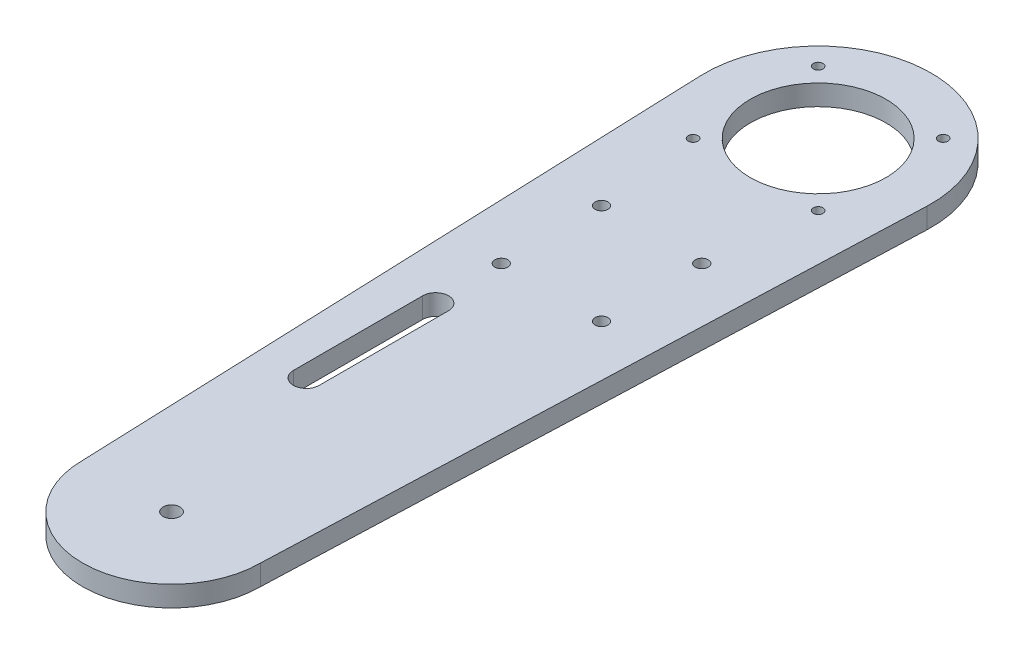
ISO-10303-21;
HEADER;
FILE_DESCRIPTION(('STEP AP214'),'2;1');
FILE_NAME('part.step','',(''),(''),'','','');
FILE_SCHEMA(('AUTOMOTIVE_DESIGN { 1 0 10303 214 1 1 1 1 }'));
ENDSEC;
DATA;
#1=APPLICATION_CONTEXT('core data for automotive mechanical design processes');
#2=APPLICATION_PROTOCOL_DEFINITION('international standard','automotive_design',2000,#1);
#3=PRODUCT_CONTEXT('',#1,'mechanical');
#4=PRODUCT('Part','Part','',(#3));
#5=PRODUCT_RELATED_PRODUCT_CATEGORY('part','',(#4));
#6=PRODUCT_DEFINITION_FORMATION('','',#4);
#7=PRODUCT_DEFINITION_CONTEXT('part definition',#1,'design');
#8=PRODUCT_DEFINITION('design','',#6,#7);
#9=PRODUCT_DEFINITION_SHAPE('','',#8);
#10=(LENGTH_UNIT() NAMED_UNIT(*) SI_UNIT(.MILLI.,.METRE.));
#11=(NAMED_UNIT(*) PLANE_ANGLE_UNIT() SI_UNIT($,.RADIAN.));
#12=(NAMED_UNIT(*) SI_UNIT($,.STERADIAN.) SOLID_ANGLE_UNIT());
#13=UNCERTAINTY_MEASURE_WITH_UNIT(LENGTH_MEASURE(1.E-05),#10,'distance_accuracy_value','');
#14=(GEOMETRIC_REPRESENTATION_CONTEXT(3) GLOBAL_UNCERTAINTY_ASSIGNED_CONTEXT((#13)) GLOBAL_UNIT_ASSIGNED_CONTEXT((#10,
#11,#12)) REPRESENTATION_CONTEXT('',''));
#15=CARTESIAN_POINT('',(0.,0.,0.));
#16=DIRECTION('',(0.,0.,1.));
#17=DIRECTION('',(1.,0.,0.));
#18=AXIS2_PLACEMENT_3D('',#15,#16,#17);
#19=CARTESIAN_POINT('',(27.4611273571522,6.35,1.03319242929476));
#20=DIRECTION('',(-0.999292974733131,0.,-0.0375972159741946));
#21=DIRECTION('',(-0.0375972159741946,0.,0.999292974733131));
#22=AXIS2_PLACEMENT_3D('',#19,#20,#21);
#23=PLANE('',#22);
#24=DIRECTION('',(0.0375972159741946,0.,-0.999292974733131));
#25=VECTOR('',#24,1.);
#26=CARTESIAN_POINT('',(27.4611273571522,0.,1.03319242929476));
#27=LINE('',#26,#25);
#28=CARTESIAN_POINT('',(27.5,0.,0.));
#29=VERTEX_POINT('',#28);
#30=CARTESIAN_POINT('',(34.9752541156596,0.,-198.684097440903));
#31=VERTEX_POINT('',#30);
#32=EDGE_CURVE('E203',#29,#31,#27,.T.);
#33=ORIENTED_EDGE('',*,*,#32,.T.);
#34=DIRECTION('',(0.,-1.,0.));
#35=VECTOR('',#34,1.);
#36=CARTESIAN_POINT('',(34.9752541156596,6.35,-198.684097440903));
#37=LINE('',#36,#35);
#38=CARTESIAN_POINT('',(34.9752541156596,6.35,-198.684097440903));
#39=VERTEX_POINT('',#38);
#40=EDGE_CURVE('E11',#39,#31,#37,.T.);
#41=ORIENTED_EDGE('',*,*,#40,.F.);
#42=DIRECTION('',(0.0375972159741946,0.,-0.999292974733131));
#43=VECTOR('',#42,1.);
#44=CARTESIAN_POINT('',(27.4611273571522,6.35,1.03319242929476));
#45=LINE('',#44,#43);
#46=CARTESIAN_POINT('',(27.5,6.35,0.));
#47=VERTEX_POINT('',#46);
#48=EDGE_CURVE('E207',#47,#39,#45,.T.);
#49=ORIENTED_EDGE('',*,*,#48,.F.);
#50=DIRECTION('',(0.,-1.,0.));
#51=VECTOR('',#50,1.);
#52=CARTESIAN_POINT('',(27.5,6.35,0.));
#53=LINE('',#52,#51);
#54=EDGE_CURVE('E222',#47,#29,#53,.T.);
#55=ORIENTED_EDGE('',*,*,#54,.T.);
#56=EDGE_LOOP('',(#33,#41,#49,#55));
#57=FACE_BOUND('',#56,.T.);
#58=ADVANCED_FACE('F41',(#57),#23,.F.);
#59=CARTESIAN_POINT('',(0.,6.35,-200.));
#60=DIRECTION('',(0.,-1.,0.));
#61=DIRECTION('',(0.,0.,-1.));
#62=AXIS2_PLACEMENT_3D('',#59,#60,#61);
#63=CYLINDRICAL_SURFACE('',#62,35.);
#64=CARTESIAN_POINT('',(0.,0.,-200.));
#65=DIRECTION('',(0.,1.,0.));
#66=DIRECTION('',(0.,0.,1.));
#67=AXIS2_PLACEMENT_3D('',#64,#65,#66);
#68=CIRCLE('',#67,35.);
#69=CARTESIAN_POINT('',(-34.9752541156596,0.,-198.684097440903));
#70=VERTEX_POINT('',#69);
#71=EDGE_CURVE('E226',#31,#70,#68,.T.);
#72=ORIENTED_EDGE('',*,*,#71,.T.);
#73=DIRECTION('',(0.,-1.,0.));
#74=VECTOR('',#73,1.);
#75=CARTESIAN_POINT('',(-34.9752541156596,6.35,-198.684097440903));
#76=LINE('',#75,#74);
#77=CARTESIAN_POINT('',(-34.9752541156596,6.35,-198.684097440903));
#78=VERTEX_POINT('',#77);
#79=EDGE_CURVE('E49',#78,#70,#76,.T.);
#80=ORIENTED_EDGE('',*,*,#79,.F.);
#81=CARTESIAN_POINT('',(0.,6.35,-200.));
#82=DIRECTION('',(0.,1.,0.));
#83=DIRECTION('',(0.,0.,1.));
#84=AXIS2_PLACEMENT_3D('',#81,#82,#83);
#85=CIRCLE('',#84,35.);
#86=EDGE_CURVE('E211',#39,#78,#85,.T.);
#87=ORIENTED_EDGE('',*,*,#86,.F.);
#88=ORIENTED_EDGE('',*,*,#40,.T.);
#89=EDGE_LOOP('',(#72,#80,#87,#88));
#90=FACE_BOUND('',#89,.T.);
#91=ADVANCED_FACE('F248',(#90),#63,.T.);
#92=CARTESIAN_POINT('',(-27.4611273571522,6.35,1.03319242929476));
#93=DIRECTION('',(-0.999292974733131,0.,0.0375972159741946));
#94=DIRECTION('',(0.0375972159741946,0.,0.999292974733131));
#95=AXIS2_PLACEMENT_3D('',#92,#93,#94);
#96=PLANE('',#95);
#97=DIRECTION('',(-0.0375972159741946,0.,-0.999292974733131));
#98=VECTOR('',#97,1.);
#99=CARTESIAN_POINT('',(-27.4611273571522,0.,1.03319242929476));
#100=LINE('',#99,#98);
#101=CARTESIAN_POINT('',(-27.5,0.,0.));
#102=VERTEX_POINT('',#101);
#103=EDGE_CURVE('E230',#102,#70,#100,.T.);
#104=ORIENTED_EDGE('',*,*,#103,.F.);
#105=DIRECTION('',(0.,-1.,0.));
#106=VECTOR('',#105,1.);
#107=CARTESIAN_POINT('',(-27.5,6.35,0.));
#108=LINE('',#107,#106);
#109=CARTESIAN_POINT('',(-27.5,6.35,0.));
#110=VERTEX_POINT('',#109);
#111=EDGE_CURVE('E239',#110,#102,#108,.T.);
#112=ORIENTED_EDGE('',*,*,#111,.F.);
#113=DIRECTION('',(-0.0375972159741946,0.,-0.999292974733131));
#114=VECTOR('',#113,1.);
#115=CARTESIAN_POINT('',(-27.4611273571522,6.35,1.03319242929476));
#116=LINE('',#115,#114);
#117=EDGE_CURVE('E215',#110,#78,#116,.T.);
#118=ORIENTED_EDGE('',*,*,#117,.T.);
#119=ORIENTED_EDGE('',*,*,#79,.T.);
#120=EDGE_LOOP('',(#104,#112,#118,#119));
#121=FACE_BOUND('',#120,.T.);
#122=ADVANCED_FACE('F245',(#121),#96,.T.);
#123=CARTESIAN_POINT('',(0.,6.35,0.));
#124=DIRECTION('',(0.,-1.,0.));
#125=DIRECTION('',(0.,0.,-1.));
#126=AXIS2_PLACEMENT_3D('',#123,#124,#125);
#127=CYLINDRICAL_SURFACE('',#126,27.5);
#128=CARTESIAN_POINT('',(0.,0.,0.));
#129=DIRECTION('',(0.,1.,0.));
#130=DIRECTION('',(0.,0.,1.));
#131=AXIS2_PLACEMENT_3D('',#128,#129,#130);
#132=CIRCLE('',#131,27.5);
#133=EDGE_CURVE('E212',#102,#29,#132,.T.);
#134=ORIENTED_EDGE('',*,*,#133,.T.);
#135=ORIENTED_EDGE('',*,*,#54,.F.);
#136=CARTESIAN_POINT('',(0.,6.35,0.));
#137=DIRECTION('',(0.,1.,0.));
#138=DIRECTION('',(0.,0.,1.));
#139=AXIS2_PLACEMENT_3D('',#136,#137,#138);
#140=CIRCLE('',#139,27.5);
#141=EDGE_CURVE('E219',#110,#47,#140,.T.);
#142=ORIENTED_EDGE('',*,*,#141,.F.);
#143=ORIENTED_EDGE('',*,*,#111,.T.);
#144=EDGE_LOOP('',(#134,#135,#142,#143));
#145=FACE_BOUND('',#144,.T.);
#146=ADVANCED_FACE('F255',(#145),#127,.T.);
#147=CARTESIAN_POINT('',(0.,6.35,0.));
#148=DIRECTION('',(0.,1.,0.));
#149=DIRECTION('',(0.,0.,1.));
#150=AXIS2_PLACEMENT_3D('',#147,#148,#149);
#151=PLANE('',#150);
#152=CARTESIAN_POINT('',(-15.5,6.35,-117.5));
#153=DIRECTION('',(0.,-1.,0.));
#154=DIRECTION('',(0.,0.,-1.));
#155=AXIS2_PLACEMENT_3D('',#152,#153,#154);
#156=CIRCLE('',#155,2.);
#157=CARTESIAN_POINT('',(-15.5,6.35,-119.5));
#158=VERTEX_POINT('',#157);
#159=EDGE_CURVE('E438',#158,#158,#156,.T.);
#160=ORIENTED_EDGE('',*,*,#159,.T.);
#161=EDGE_LOOP('',(#160));
#162=FACE_BOUND('',#161,.T.);
#163=CARTESIAN_POINT('',(-15.5,6.35,-148.5));
#164=DIRECTION('',(0.,-1.,0.));
#165=DIRECTION('',(0.,0.,-1.));
#166=AXIS2_PLACEMENT_3D('',#163,#164,#165);
#167=CIRCLE('',#166,2.);
#168=CARTESIAN_POINT('',(-15.5,6.35,-150.5));
#169=VERTEX_POINT('',#168);
#170=EDGE_CURVE('E465',#169,#169,#167,.T.);
#171=ORIENTED_EDGE('',*,*,#170,.T.);
#172=EDGE_LOOP('',(#171));
#173=FACE_BOUND('',#172,.T.);
#174=CARTESIAN_POINT('',(15.5,6.35,-148.5));
#175=DIRECTION('',(0.,-1.,0.));
#176=DIRECTION('',(0.,0.,-1.));
#177=AXIS2_PLACEMENT_3D('',#174,#175,#176);
#178=CIRCLE('',#177,2.);
#179=CARTESIAN_POINT('',(15.5,6.35,-150.5));
#180=VERTEX_POINT('',#179);
#181=EDGE_CURVE('E454',#180,#180,#178,.T.);
#182=ORIENTED_EDGE('',*,*,#181,.T.);
#183=EDGE_LOOP('',(#182));
#184=FACE_BOUND('',#183,.T.);
#185=CARTESIAN_POINT('',(15.5,6.35,-117.5));
#186=DIRECTION('',(0.,-1.,0.));
#187=DIRECTION('',(0.,0.,-1.));
#188=AXIS2_PLACEMENT_3D('',#185,#186,#187);
#189=CIRCLE('',#188,2.);
#190=CARTESIAN_POINT('',(15.5,6.35,-119.5));
#191=VERTEX_POINT('',#190);
#192=EDGE_CURVE('E144',#191,#191,#189,.T.);
#193=ORIENTED_EDGE('',*,*,#192,.T.);
#194=EDGE_LOOP('',(#193));
#195=FACE_BOUND('',#194,.T.);
#196=CARTESIAN_POINT('',(-15.,6.35,-56.6999999999999));
#197=DIRECTION('',(0.,1.,0.));
#198=DIRECTION('',(0.,0.,1.));
#199=AXIS2_PLACEMENT_3D('',#196,#197,#198);
#200=CIRCLE('',#199,4.00000000000001);
#201=CARTESIAN_POINT('',(-19.,6.35,-56.6999999999999));
#202=VERTEX_POINT('',#201);
#203=CARTESIAN_POINT('',(-11.,6.35,-56.6999999999999));
#204=VERTEX_POINT('',#203);
#205=EDGE_CURVE('E56',#202,#204,#200,.T.);
#206=ORIENTED_EDGE('',*,*,#205,.F.);
#207=DIRECTION('',(0.,0.,1.));
#208=VECTOR('',#207,1.);
#209=CARTESIAN_POINT('',(-19.,6.35,-56.6999999999999));
#210=LINE('',#209,#208);
#211=CARTESIAN_POINT('',(-19.,6.35,-96.6999999999999));
#212=VERTEX_POINT('',#211);
#213=EDGE_CURVE('E127',#212,#202,#210,.T.);
#214=ORIENTED_EDGE('',*,*,#213,.F.);
#215=CARTESIAN_POINT('',(-15.,6.35,-96.6999999999999));
#216=DIRECTION('',(0.,1.,0.));
#217=DIRECTION('',(0.,0.,1.));
#218=AXIS2_PLACEMENT_3D('',#215,#216,#217);
#219=CIRCLE('',#218,4.00000000000001);
#220=CARTESIAN_POINT('',(-11.,6.35,-96.6999999999999));
#221=VERTEX_POINT('',#220);
#222=EDGE_CURVE('E131',#221,#212,#219,.T.);
#223=ORIENTED_EDGE('',*,*,#222,.F.);
#224=DIRECTION('',(0.,0.,-1.));
#225=VECTOR('',#224,1.);
#226=CARTESIAN_POINT('',(-11.,6.35,-56.6999999999999));
#227=LINE('',#226,#225);
#228=EDGE_CURVE('E143',#204,#221,#227,.T.);
#229=ORIENTED_EDGE('',*,*,#228,.F.);
#230=EDGE_LOOP('',(#206,#214,#223,#229));
#231=FACE_BOUND('',#230,.T.);
#232=CARTESIAN_POINT('',(-19.3393704654521,6.35,-180.660629534548));
#233=DIRECTION('',(0.,1.,0.));
#234=DIRECTION('',(0.,0.,1.));
#235=AXIS2_PLACEMENT_3D('',#232,#233,#234);
#236=CIRCLE('',#235,1.5);
#237=CARTESIAN_POINT('',(-19.3393704654521,6.35,-179.160629534548));
#238=VERTEX_POINT('',#237);
#239=EDGE_CURVE('E153',#238,#238,#236,.T.);
#240=ORIENTED_EDGE('',*,*,#239,.F.);
#241=EDGE_LOOP('',(#240));
#242=FACE_BOUND('',#241,.T.);
#243=CARTESIAN_POINT('',(19.3393704654521,6.35,-180.660629534548));
#244=DIRECTION('',(0.,1.,0.));
#245=DIRECTION('',(0.,0.,1.));
#246=AXIS2_PLACEMENT_3D('',#243,#244,#245);
#247=CIRCLE('',#246,1.5);
#248=CARTESIAN_POINT('',(19.3393704654521,6.35,-179.160629534548));
#249=VERTEX_POINT('',#248);
#250=EDGE_CURVE('E172',#249,#249,#247,.T.);
#251=ORIENTED_EDGE('',*,*,#250,.F.);
#252=EDGE_LOOP('',(#251));
#253=FACE_BOUND('',#252,.T.);
#254=CARTESIAN_POINT('',(19.3393704654521,6.35,-219.339370465452));
#255=DIRECTION('',(0.,1.,0.));
#256=DIRECTION('',(0.,0.,1.));
#257=AXIS2_PLACEMENT_3D('',#254,#255,#256);
#258=CIRCLE('',#257,1.5);
#259=CARTESIAN_POINT('',(19.3393704654521,6.35,-217.839370465452));
#260=VERTEX_POINT('',#259);
#261=EDGE_CURVE('E164',#260,#260,#258,.T.);
#262=ORIENTED_EDGE('',*,*,#261,.F.);
#263=EDGE_LOOP('',(#262));
#264=FACE_BOUND('',#263,.T.);
#265=CARTESIAN_POINT('',(-19.3393704654521,6.35,-219.339370465452));
#266=DIRECTION('',(0.,1.,0.));
#267=DIRECTION('',(0.,0.,1.));
#268=AXIS2_PLACEMENT_3D('',#265,#266,#267);
#269=CIRCLE('',#268,1.5);
#270=CARTESIAN_POINT('',(-19.3393704654521,6.35,-217.839370465452));
#271=VERTEX_POINT('',#270);
#272=EDGE_CURVE('E163',#271,#271,#269,.T.);
#273=ORIENTED_EDGE('',*,*,#272,.F.);
#274=EDGE_LOOP('',(#273));
#275=FACE_BOUND('',#274,.T.);
#276=CARTESIAN_POINT('',(0.,6.35,-200.));
#277=DIRECTION('',(0.,1.,0.));
#278=DIRECTION('',(0.,0.,1.));
#279=AXIS2_PLACEMENT_3D('',#276,#277,#278);
#280=CIRCLE('',#279,21.);
#281=CARTESIAN_POINT('',(0.,6.35,-179.));
#282=VERTEX_POINT('',#281);
#283=EDGE_CURVE('E187',#282,#282,#280,.T.);
#284=ORIENTED_EDGE('',*,*,#283,.F.);
#285=EDGE_LOOP('',(#284));
#286=FACE_BOUND('',#285,.T.);
#287=CARTESIAN_POINT('',(0.,6.35,0.));
#288=DIRECTION('',(0.,1.,0.));
#289=DIRECTION('',(0.,0.,1.));
#290=AXIS2_PLACEMENT_3D('',#287,#288,#289);
#291=CIRCLE('',#290,2.6);
#292=CARTESIAN_POINT('',(0.,6.35,2.6));
#293=VERTEX_POINT('',#292);
#294=EDGE_CURVE('E195',#293,#293,#291,.T.);
#295=ORIENTED_EDGE('',*,*,#294,.F.);
#296=EDGE_LOOP('',(#295));
#297=FACE_BOUND('',#296,.T.);
#298=ORIENTED_EDGE('',*,*,#48,.T.);
#299=ORIENTED_EDGE('',*,*,#86,.T.);
#300=ORIENTED_EDGE('',*,*,#117,.F.);
#301=ORIENTED_EDGE('',*,*,#141,.T.);
#302=EDGE_LOOP('',(#298,#299,#300,#301));
#303=FACE_BOUND('',#302,.T.);
#304=ADVANCED_FACE('F260',(#162,#173,#184,#195,#231,#242,#253,#264,#275,#286,#297,#303),#151,.T.);
#305=CARTESIAN_POINT('',(0.,0.,0.));
#306=DIRECTION('',(0.,1.,0.));
#307=DIRECTION('',(0.,0.,1.));
#308=AXIS2_PLACEMENT_3D('',#305,#306,#307);
#309=PLANE('',#308);
#310=CARTESIAN_POINT('',(-15.5,0.,-117.5));
#311=DIRECTION('',(0.,-1.,0.));
#312=DIRECTION('',(0.,0.,-1.));
#313=AXIS2_PLACEMENT_3D('',#310,#311,#312);
#314=CIRCLE('',#313,2.);
#315=CARTESIAN_POINT('',(-15.5,0.,-119.5));
#316=VERTEX_POINT('',#315);
#317=EDGE_CURVE('E441',#316,#316,#314,.T.);
#318=ORIENTED_EDGE('',*,*,#317,.F.);
#319=EDGE_LOOP('',(#318));
#320=FACE_BOUND('',#319,.T.);
#321=CARTESIAN_POINT('',(-15.5,0.,-148.5));
#322=DIRECTION('',(0.,-1.,0.));
#323=DIRECTION('',(0.,0.,-1.));
#324=AXIS2_PLACEMENT_3D('',#321,#322,#323);
#325=CIRCLE('',#324,2.);
#326=CARTESIAN_POINT('',(-15.5,0.,-150.5));
#327=VERTEX_POINT('',#326);
#328=EDGE_CURVE('E445',#327,#327,#325,.T.);
#329=ORIENTED_EDGE('',*,*,#328,.F.);
#330=EDGE_LOOP('',(#329));
#331=FACE_BOUND('',#330,.T.);
#332=CARTESIAN_POINT('',(15.5,0.,-148.5));
#333=DIRECTION('',(0.,-1.,0.));
#334=DIRECTION('',(0.,0.,-1.));
#335=AXIS2_PLACEMENT_3D('',#332,#333,#334);
#336=CIRCLE('',#335,2.);
#337=CARTESIAN_POINT('',(15.5,0.,-150.5));
#338=VERTEX_POINT('',#337);
#339=EDGE_CURVE('E459',#338,#338,#336,.T.);
#340=ORIENTED_EDGE('',*,*,#339,.F.);
#341=EDGE_LOOP('',(#340));
#342=FACE_BOUND('',#341,.T.);
#343=CARTESIAN_POINT('',(15.5,0.,-117.5));
#344=DIRECTION('',(0.,-1.,0.));
#345=DIRECTION('',(0.,0.,-1.));
#346=AXIS2_PLACEMENT_3D('',#343,#344,#345);
#347=CIRCLE('',#346,2.);
#348=CARTESIAN_POINT('',(15.5,0.,-119.5));
#349=VERTEX_POINT('',#348);
#350=EDGE_CURVE('E134',#349,#349,#347,.T.);
#351=ORIENTED_EDGE('',*,*,#350,.F.);
#352=EDGE_LOOP('',(#351));
#353=FACE_BOUND('',#352,.T.);
#354=DIRECTION('',(0.,0.,1.));
#355=VECTOR('',#354,1.);
#356=CARTESIAN_POINT('',(-19.,0.,-56.6999999999999));
#357=LINE('',#356,#355);
#358=CARTESIAN_POINT('',(-19.,0.,-96.6999999999999));
#359=VERTEX_POINT('',#358);
#360=CARTESIAN_POINT('',(-19.,0.,-56.6999999999999));
#361=VERTEX_POINT('',#360);
#362=EDGE_CURVE('E115',#359,#361,#357,.T.);
#363=ORIENTED_EDGE('',*,*,#362,.T.);
#364=CARTESIAN_POINT('',(-15.,0.,-56.6999999999999));
#365=DIRECTION('',(0.,1.,0.));
#366=DIRECTION('',(0.,0.,1.));
#367=AXIS2_PLACEMENT_3D('',#364,#365,#366);
#368=CIRCLE('',#367,4.00000000000001);
#369=CARTESIAN_POINT('',(-11.,0.,-56.6999999999999));
#370=VERTEX_POINT('',#369);
#371=EDGE_CURVE('E108',#361,#370,#368,.T.);
#372=ORIENTED_EDGE('',*,*,#371,.T.);
#373=DIRECTION('',(0.,0.,-1.));
#374=VECTOR('',#373,1.);
#375=CARTESIAN_POINT('',(-11.,0.,-56.6999999999999));
#376=LINE('',#375,#374);
#377=CARTESIAN_POINT('',(-11.,0.,-96.6999999999999));
#378=VERTEX_POINT('',#377);
#379=EDGE_CURVE('E118',#370,#378,#376,.T.);
#380=ORIENTED_EDGE('',*,*,#379,.T.);
#381=CARTESIAN_POINT('',(-15.,0.,-96.6999999999999));
#382=DIRECTION('',(0.,1.,0.));
#383=DIRECTION('',(0.,0.,1.));
#384=AXIS2_PLACEMENT_3D('',#381,#382,#383);
#385=CIRCLE('',#384,4.00000000000001);
#386=EDGE_CURVE('E64',#378,#359,#385,.T.);
#387=ORIENTED_EDGE('',*,*,#386,.T.);
#388=EDGE_LOOP('',(#363,#372,#380,#387));
#389=FACE_BOUND('',#388,.T.);
#390=CARTESIAN_POINT('',(-19.3393704654521,0.,-180.660629534548));
#391=DIRECTION('',(0.,1.,0.));
#392=DIRECTION('',(0.,0.,1.));
#393=AXIS2_PLACEMENT_3D('',#390,#391,#392);
#394=CIRCLE('',#393,1.5);
#395=CARTESIAN_POINT('',(-19.3393704654521,0.,-179.160629534548));
#396=VERTEX_POINT('',#395);
#397=EDGE_CURVE('E176',#396,#396,#394,.T.);
#398=ORIENTED_EDGE('',*,*,#397,.T.);
#399=EDGE_LOOP('',(#398));
#400=FACE_BOUND('',#399,.T.);
#401=CARTESIAN_POINT('',(19.3393704654521,0.,-180.660629534548));
#402=DIRECTION('',(0.,1.,0.));
#403=DIRECTION('',(0.,0.,1.));
#404=AXIS2_PLACEMENT_3D('',#401,#402,#403);
#405=CIRCLE('',#404,1.5);
#406=CARTESIAN_POINT('',(19.3393704654521,0.,-179.160629534548));
#407=VERTEX_POINT('',#406);
#408=EDGE_CURVE('E168',#407,#407,#405,.T.);
#409=ORIENTED_EDGE('',*,*,#408,.T.);
#410=EDGE_LOOP('',(#409));
#411=FACE_BOUND('',#410,.T.);
#412=CARTESIAN_POINT('',(19.3393704654521,0.,-219.339370465452));
#413=DIRECTION('',(0.,1.,0.));
#414=DIRECTION('',(0.,0.,1.));
#415=AXIS2_PLACEMENT_3D('',#412,#413,#414);
#416=CIRCLE('',#415,1.5);
#417=CARTESIAN_POINT('',(19.3393704654521,0.,-217.839370465452));
#418=VERTEX_POINT('',#417);
#419=EDGE_CURVE('E159',#418,#418,#416,.T.);
#420=ORIENTED_EDGE('',*,*,#419,.T.);
#421=EDGE_LOOP('',(#420));
#422=FACE_BOUND('',#421,.T.);
#423=CARTESIAN_POINT('',(-19.3393704654521,0.,-219.339370465452));
#424=DIRECTION('',(0.,1.,0.));
#425=DIRECTION('',(0.,0.,1.));
#426=AXIS2_PLACEMENT_3D('',#423,#424,#425);
#427=CIRCLE('',#426,1.5);
#428=CARTESIAN_POINT('',(-19.3393704654521,0.,-217.839370465452));
#429=VERTEX_POINT('',#428);
#430=EDGE_CURVE('E183',#429,#429,#427,.T.);
#431=ORIENTED_EDGE('',*,*,#430,.T.);
#432=EDGE_LOOP('',(#431));
#433=FACE_BOUND('',#432,.T.);
#434=CARTESIAN_POINT('',(0.,0.,-200.));
#435=DIRECTION('',(0.,1.,0.));
#436=DIRECTION('',(0.,0.,1.));
#437=AXIS2_PLACEMENT_3D('',#434,#435,#436);
#438=CIRCLE('',#437,21.);
#439=CARTESIAN_POINT('',(0.,0.,-179.));
#440=VERTEX_POINT('',#439);
#441=EDGE_CURVE('E191',#440,#440,#438,.T.);
#442=ORIENTED_EDGE('',*,*,#441,.T.);
#443=EDGE_LOOP('',(#442));
#444=FACE_BOUND('',#443,.T.);
#445=CARTESIAN_POINT('',(0.,0.,0.));
#446=DIRECTION('',(0.,1.,0.));
#447=DIRECTION('',(0.,0.,1.));
#448=AXIS2_PLACEMENT_3D('',#445,#446,#447);
#449=CIRCLE('',#448,2.6);
#450=CARTESIAN_POINT('',(0.,0.,2.6));
#451=VERTEX_POINT('',#450);
#452=EDGE_CURVE('E199',#451,#451,#449,.T.);
#453=ORIENTED_EDGE('',*,*,#452,.T.);
#454=EDGE_LOOP('',(#453));
#455=FACE_BOUND('',#454,.T.);
#456=ORIENTED_EDGE('',*,*,#32,.F.);
#457=ORIENTED_EDGE('',*,*,#133,.F.);
#458=ORIENTED_EDGE('',*,*,#103,.T.);
#459=ORIENTED_EDGE('',*,*,#71,.F.);
#460=EDGE_LOOP('',(#456,#457,#458,#459));
#461=FACE_BOUND('',#460,.T.);
#462=ADVANCED_FACE('F123',(#320,#331,#342,#353,#389,#400,#411,#422,#433,#444,#455,#461),#309,.F.);
#463=CARTESIAN_POINT('',(0.,0.,0.));
#464=DIRECTION('',(0.,1.,0.));
#465=DIRECTION('',(0.,0.,1.));
#466=AXIS2_PLACEMENT_3D('',#463,#464,#465);
#467=CYLINDRICAL_SURFACE('',#466,2.6);
#468=ORIENTED_EDGE('',*,*,#452,.F.);
#469=EDGE_LOOP('',(#468));
#470=FACE_BOUND('',#469,.T.);
#471=ORIENTED_EDGE('',*,*,#294,.T.);
#472=EDGE_LOOP('',(#471));
#473=FACE_BOUND('',#472,.T.);
#474=ADVANCED_FACE('F268',(#470,#473),#467,.F.);
#475=CARTESIAN_POINT('',(0.,0.,-200.));
#476=DIRECTION('',(0.,1.,0.));
#477=DIRECTION('',(0.,0.,1.));
#478=AXIS2_PLACEMENT_3D('',#475,#476,#477);
#479=CYLINDRICAL_SURFACE('',#478,21.);
#480=ORIENTED_EDGE('',*,*,#441,.F.);
#481=EDGE_LOOP('',(#480));
#482=FACE_BOUND('',#481,.T.);
#483=ORIENTED_EDGE('',*,*,#283,.T.);
#484=EDGE_LOOP('',(#483));
#485=FACE_BOUND('',#484,.T.);
#486=ADVANCED_FACE('F299',(#482,#485),#479,.F.);
#487=CARTESIAN_POINT('',(-19.3393704654521,0.,-219.339370465452));
#488=DIRECTION('',(0.,1.,0.));
#489=DIRECTION('',(0.,0.,1.));
#490=AXIS2_PLACEMENT_3D('',#487,#488,#489);
#491=CYLINDRICAL_SURFACE('',#490,1.5);
#492=ORIENTED_EDGE('',*,*,#430,.F.);
#493=EDGE_LOOP('',(#492));
#494=FACE_BOUND('',#493,.T.);
#495=ORIENTED_EDGE('',*,*,#272,.T.);
#496=EDGE_LOOP('',(#495));
#497=FACE_BOUND('',#496,.T.);
#498=ADVANCED_FACE('F309',(#494,#497),#491,.F.);
#499=CARTESIAN_POINT('',(19.3393704654521,0.,-219.339370465452));
#500=DIRECTION('',(0.,1.,0.));
#501=DIRECTION('',(0.,0.,1.));
#502=AXIS2_PLACEMENT_3D('',#499,#500,#501);
#503=CYLINDRICAL_SURFACE('',#502,1.5);
#504=ORIENTED_EDGE('',*,*,#419,.F.);
#505=EDGE_LOOP('',(#504));
#506=FACE_BOUND('',#505,.T.);
#507=ORIENTED_EDGE('',*,*,#261,.T.);
#508=EDGE_LOOP('',(#507));
#509=FACE_BOUND('',#508,.T.);
#510=ADVANCED_FACE('F319',(#506,#509),#503,.F.);
#511=CARTESIAN_POINT('',(19.3393704654521,0.,-180.660629534548));
#512=DIRECTION('',(0.,1.,0.));
#513=DIRECTION('',(0.,0.,1.));
#514=AXIS2_PLACEMENT_3D('',#511,#512,#513);
#515=CYLINDRICAL_SURFACE('',#514,1.5);
#516=ORIENTED_EDGE('',*,*,#408,.F.);
#517=EDGE_LOOP('',(#516));
#518=FACE_BOUND('',#517,.T.);
#519=ORIENTED_EDGE('',*,*,#250,.T.);
#520=EDGE_LOOP('',(#519));
#521=FACE_BOUND('',#520,.T.);
#522=ADVANCED_FACE('F329',(#518,#521),#515,.F.);
#523=CARTESIAN_POINT('',(-19.3393704654521,0.,-180.660629534548));
#524=DIRECTION('',(0.,1.,0.));
#525=DIRECTION('',(0.,0.,1.));
#526=AXIS2_PLACEMENT_3D('',#523,#524,#525);
#527=CYLINDRICAL_SURFACE('',#526,1.5);
#528=ORIENTED_EDGE('',*,*,#397,.F.);
#529=EDGE_LOOP('',(#528));
#530=FACE_BOUND('',#529,.T.);
#531=ORIENTED_EDGE('',*,*,#239,.T.);
#532=EDGE_LOOP('',(#531));
#533=FACE_BOUND('',#532,.T.);
#534=ADVANCED_FACE('F339',(#530,#533),#527,.F.);
#535=CARTESIAN_POINT('',(-15.,0.,-56.6999999999999));
#536=DIRECTION('',(0.,1.,0.));
#537=DIRECTION('',(0.,0.,1.));
#538=AXIS2_PLACEMENT_3D('',#535,#536,#537);
#539=CYLINDRICAL_SURFACE('',#538,4.00000000000001);
#540=ORIENTED_EDGE('',*,*,#205,.T.);
#541=DIRECTION('',(0.,1.,0.));
#542=VECTOR('',#541,1.);
#543=CARTESIAN_POINT('',(-11.,0.,-56.6999999999999));
#544=LINE('',#543,#542);
#545=EDGE_CURVE('E104',#370,#204,#544,.T.);
#546=ORIENTED_EDGE('',*,*,#545,.F.);
#547=ORIENTED_EDGE('',*,*,#371,.F.);
#548=DIRECTION('',(0.,1.,0.));
#549=VECTOR('',#548,1.);
#550=CARTESIAN_POINT('',(-19.,0.,-56.6999999999999));
#551=LINE('',#550,#549);
#552=EDGE_CURVE('E150',#361,#202,#551,.T.);
#553=ORIENTED_EDGE('',*,*,#552,.T.);
#554=EDGE_LOOP('',(#540,#546,#547,#553));
#555=FACE_BOUND('',#554,.T.);
#556=ADVANCED_FACE('F106',(#555),#539,.F.);
#557=CARTESIAN_POINT('',(-19.,0.,-56.6999999999999));
#558=DIRECTION('',(-1.,0.,0.));
#559=DIRECTION('',(0.,0.,1.));
#560=AXIS2_PLACEMENT_3D('',#557,#558,#559);
#561=PLANE('',#560);
#562=ORIENTED_EDGE('',*,*,#213,.T.);
#563=ORIENTED_EDGE('',*,*,#552,.F.);
#564=ORIENTED_EDGE('',*,*,#362,.F.);
#565=DIRECTION('',(0.,1.,0.));
#566=VECTOR('',#565,1.);
#567=CARTESIAN_POINT('',(-19.,0.,-96.6999999999999));
#568=LINE('',#567,#566);
#569=EDGE_CURVE('E154',#359,#212,#568,.T.);
#570=ORIENTED_EDGE('',*,*,#569,.T.);
#571=EDGE_LOOP('',(#562,#563,#564,#570));
#572=FACE_BOUND('',#571,.T.);
#573=ADVANCED_FACE('F358',(#572),#561,.F.);
#574=CARTESIAN_POINT('',(-15.,0.,-96.6999999999999));
#575=DIRECTION('',(0.,1.,0.));
#576=DIRECTION('',(0.,0.,1.));
#577=AXIS2_PLACEMENT_3D('',#574,#575,#576);
#578=CYLINDRICAL_SURFACE('',#577,4.00000000000001);
#579=ORIENTED_EDGE('',*,*,#222,.T.);
#580=ORIENTED_EDGE('',*,*,#569,.F.);
#581=ORIENTED_EDGE('',*,*,#386,.F.);
#582=DIRECTION('',(0.,1.,0.));
#583=VECTOR('',#582,1.);
#584=CARTESIAN_POINT('',(-11.,0.,-96.6999999999999));
#585=LINE('',#584,#583);
#586=EDGE_CURVE('E114',#378,#221,#585,.T.);
#587=ORIENTED_EDGE('',*,*,#586,.T.);
#588=EDGE_LOOP('',(#579,#580,#581,#587));
#589=FACE_BOUND('',#588,.T.);
#590=ADVANCED_FACE('F367',(#589),#578,.F.);
#591=CARTESIAN_POINT('',(-11.,0.,-56.6999999999999));
#592=DIRECTION('',(1.,0.,0.));
#593=DIRECTION('',(0.,0.,-1.));
#594=AXIS2_PLACEMENT_3D('',#591,#592,#593);
#595=PLANE('',#594);
#596=ORIENTED_EDGE('',*,*,#228,.T.);
#597=ORIENTED_EDGE('',*,*,#586,.F.);
#598=ORIENTED_EDGE('',*,*,#379,.F.);
#599=ORIENTED_EDGE('',*,*,#545,.T.);
#600=EDGE_LOOP('',(#596,#597,#598,#599));
#601=FACE_BOUND('',#600,.T.);
#602=ADVANCED_FACE('F119',(#601),#595,.F.);
#603=CARTESIAN_POINT('',(15.5,6.35,-117.5));
#604=DIRECTION('',(0.,-1.,0.));
#605=DIRECTION('',(0.,0.,-1.));
#606=AXIS2_PLACEMENT_3D('',#603,#604,#605);
#607=CYLINDRICAL_SURFACE('',#606,2.);
#608=ORIENTED_EDGE('',*,*,#192,.F.);
#609=EDGE_LOOP('',(#608));
#610=FACE_BOUND('',#609,.T.);
#611=ORIENTED_EDGE('',*,*,#350,.T.);
#612=EDGE_LOOP('',(#611));
#613=FACE_BOUND('',#612,.T.);
#614=ADVANCED_FACE('F384',(#610,#613),#607,.F.);
#615=CARTESIAN_POINT('',(15.5,6.35,-148.5));
#616=DIRECTION('',(0.,-1.,0.));
#617=DIRECTION('',(0.,0.,-1.));
#618=AXIS2_PLACEMENT_3D('',#615,#616,#617);
#619=CYLINDRICAL_SURFACE('',#618,2.);
#620=ORIENTED_EDGE('',*,*,#181,.F.);
#621=EDGE_LOOP('',(#620));
#622=FACE_BOUND('',#621,.T.);
#623=ORIENTED_EDGE('',*,*,#339,.T.);
#624=EDGE_LOOP('',(#623));
#625=FACE_BOUND('',#624,.T.);
#626=ADVANCED_FACE('F402',(#622,#625),#619,.F.);
#627=CARTESIAN_POINT('',(-15.5,6.35,-148.5));
#628=DIRECTION('',(0.,-1.,0.));
#629=DIRECTION('',(0.,0.,-1.));
#630=AXIS2_PLACEMENT_3D('',#627,#628,#629);
#631=CYLINDRICAL_SURFACE('',#630,2.);
#632=ORIENTED_EDGE('',*,*,#170,.F.);
#633=EDGE_LOOP('',(#632));
#634=FACE_BOUND('',#633,.T.);
#635=ORIENTED_EDGE('',*,*,#328,.T.);
#636=EDGE_LOOP('',(#635));
#637=FACE_BOUND('',#636,.T.);
#638=ADVANCED_FACE('F412',(#634,#637),#631,.F.);
#639=CARTESIAN_POINT('',(-15.5,6.35,-117.5));
#640=DIRECTION('',(0.,-1.,0.));
#641=DIRECTION('',(0.,0.,-1.));
#642=AXIS2_PLACEMENT_3D('',#639,#640,#641);
#643=CYLINDRICAL_SURFACE('',#642,2.);
#644=ORIENTED_EDGE('',*,*,#159,.F.);
#645=EDGE_LOOP('',(#644));
#646=FACE_BOUND('',#645,.T.);
#647=ORIENTED_EDGE('',*,*,#317,.T.);
#648=EDGE_LOOP('',(#647));
#649=FACE_BOUND('',#648,.T.);
#650=ADVANCED_FACE('F422',(#646,#649),#643,.F.);
#651=CLOSED_SHELL('',(#58,#91,#122,#146,#304,#462,#474,#486,#498,#510,#522,#534,#556,#573,#590,
#602,#614,#626,#638,#650));
#652=MANIFOLD_SOLID_BREP('B2',#651);
#653=ADVANCED_BREP_SHAPE_REPRESENTATION('',(#18,#652),#14);
#654=SHAPE_DEFINITION_REPRESENTATION(#9,#653);
ENDSEC;
END-ISO-10303-21;
